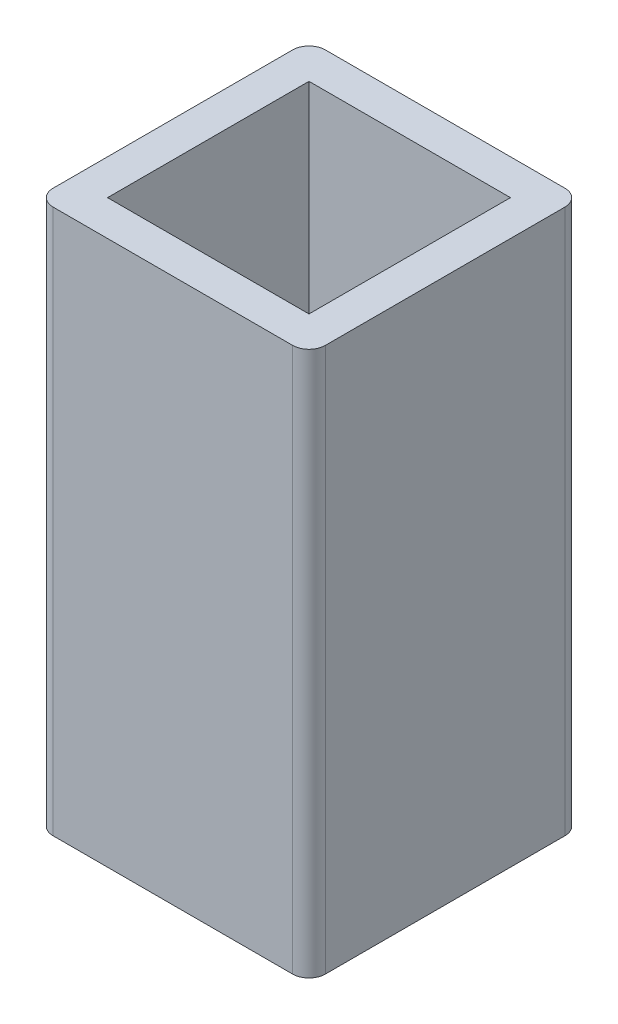
ISO-10303-21;
HEADER;
FILE_DESCRIPTION(('STEP AP214'),'2;1');
FILE_NAME('part.step','',(''),(''),'','','');
FILE_SCHEMA(('AUTOMOTIVE_DESIGN { 1 0 10303 214 1 1 1 1 }'));
ENDSEC;
DATA;
#1=APPLICATION_CONTEXT('core data for automotive mechanical design processes');
#2=APPLICATION_PROTOCOL_DEFINITION('international standard','automotive_design',2000,#1);
#3=PRODUCT_CONTEXT('',#1,'mechanical');
#4=PRODUCT('Part','Part','',(#3));
#5=PRODUCT_RELATED_PRODUCT_CATEGORY('part','',(#4));
#6=PRODUCT_DEFINITION_FORMATION('','',#4);
#7=PRODUCT_DEFINITION_CONTEXT('part definition',#1,'design');
#8=PRODUCT_DEFINITION('design','',#6,#7);
#9=PRODUCT_DEFINITION_SHAPE('','',#8);
#10=(LENGTH_UNIT() NAMED_UNIT(*) SI_UNIT(.MILLI.,.METRE.));
#11=(NAMED_UNIT(*) PLANE_ANGLE_UNIT() SI_UNIT($,.RADIAN.));
#12=(NAMED_UNIT(*) SI_UNIT($,.STERADIAN.) SOLID_ANGLE_UNIT());
#13=UNCERTAINTY_MEASURE_WITH_UNIT(LENGTH_MEASURE(1.E-05),#10,'distance_accuracy_value','');
#14=(GEOMETRIC_REPRESENTATION_CONTEXT(3) GLOBAL_UNCERTAINTY_ASSIGNED_CONTEXT((#13)) GLOBAL_UNIT_ASSIGNED_CONTEXT((#10,
#11,#12)) REPRESENTATION_CONTEXT('',''));
#15=CARTESIAN_POINT('',(0.,0.,0.));
#16=DIRECTION('',(0.,0.,1.));
#17=DIRECTION('',(1.,0.,0.));
#18=AXIS2_PLACEMENT_3D('',#15,#16,#17);
#19=CARTESIAN_POINT('',(-5.588,25.4,5.588));
#20=DIRECTION('',(0.,-1.,0.));
#21=DIRECTION('',(0.,0.,-1.));
#22=AXIS2_PLACEMENT_3D('',#19,#20,#21);
#23=PLANE('',#22);
#24=CARTESIAN_POINT('',(-5.588,25.4,5.588));
#25=DIRECTION('',(0.,1.,0.));
#26=DIRECTION('',(0.,0.,-1.));
#27=AXIS2_PLACEMENT_3D('',#24,#25,#26);
#28=CIRCLE('',#27,0.761999999999999);
#29=CARTESIAN_POINT('',(-6.35,25.4,5.588));
#30=VERTEX_POINT('',#29);
#31=CARTESIAN_POINT('',(-5.588,25.4,6.35));
#32=VERTEX_POINT('',#31);
#33=EDGE_CURVE('E183',#30,#32,#28,.T.);
#34=ORIENTED_EDGE('',*,*,#33,.T.);
#35=DIRECTION('',(1.,0.,0.));
#36=VECTOR('',#35,1.);
#37=CARTESIAN_POINT('',(-5.588,25.4,6.35));
#38=LINE('',#37,#36);
#39=CARTESIAN_POINT('',(5.588,25.4,6.35));
#40=VERTEX_POINT('',#39);
#41=EDGE_CURVE('E187',#32,#40,#38,.T.);
#42=ORIENTED_EDGE('',*,*,#41,.T.);
#43=CARTESIAN_POINT('',(5.588,25.4,5.588));
#44=DIRECTION('',(0.,1.,0.));
#45=DIRECTION('',(0.,0.,1.));
#46=AXIS2_PLACEMENT_3D('',#43,#44,#45);
#47=CIRCLE('',#46,0.761999999999999);
#48=CARTESIAN_POINT('',(6.35,25.4,5.588));
#49=VERTEX_POINT('',#48);
#50=EDGE_CURVE('E191',#40,#49,#47,.T.);
#51=ORIENTED_EDGE('',*,*,#50,.T.);
#52=DIRECTION('',(0.,0.,-1.));
#53=VECTOR('',#52,1.);
#54=CARTESIAN_POINT('',(6.35,25.4,5.588));
#55=LINE('',#54,#53);
#56=CARTESIAN_POINT('',(6.35,25.4,-5.588));
#57=VERTEX_POINT('',#56);
#58=EDGE_CURVE('E194',#49,#57,#55,.T.);
#59=ORIENTED_EDGE('',*,*,#58,.T.);
#60=CARTESIAN_POINT('',(5.588,25.4,-5.588));
#61=DIRECTION('',(0.,1.,0.));
#62=DIRECTION('',(0.,0.,-1.));
#63=AXIS2_PLACEMENT_3D('',#60,#61,#62);
#64=CIRCLE('',#63,0.761999999999999);
#65=CARTESIAN_POINT('',(5.588,25.4,-6.35));
#66=VERTEX_POINT('',#65);
#67=EDGE_CURVE('E197',#57,#66,#64,.T.);
#68=ORIENTED_EDGE('',*,*,#67,.T.);
#69=DIRECTION('',(-1.,0.,0.));
#70=VECTOR('',#69,1.);
#71=CARTESIAN_POINT('',(-5.588,25.4,-6.35));
#72=LINE('',#71,#70);
#73=CARTESIAN_POINT('',(-5.588,25.4,-6.35));
#74=VERTEX_POINT('',#73);
#75=EDGE_CURVE('E200',#66,#74,#72,.T.);
#76=ORIENTED_EDGE('',*,*,#75,.T.);
#77=CARTESIAN_POINT('',(-5.588,25.4,-5.588));
#78=DIRECTION('',(0.,1.,0.));
#79=DIRECTION('',(0.,0.,-1.));
#80=AXIS2_PLACEMENT_3D('',#77,#78,#79);
#81=CIRCLE('',#80,0.762000000000001);
#82=CARTESIAN_POINT('',(-6.35,25.4,-5.588));
#83=VERTEX_POINT('',#82);
#84=EDGE_CURVE('E203',#74,#83,#81,.T.);
#85=ORIENTED_EDGE('',*,*,#84,.T.);
#86=DIRECTION('',(0.,0.,1.));
#87=VECTOR('',#86,1.);
#88=CARTESIAN_POINT('',(-6.35,25.4,5.588));
#89=LINE('',#88,#87);
#90=EDGE_CURVE('E206',#83,#30,#89,.T.);
#91=ORIENTED_EDGE('',*,*,#90,.T.);
#92=EDGE_LOOP('',(#34,#42,#51,#59,#68,#76,#85,#91));
#93=FACE_BOUND('',#92,.T.);
#94=DIRECTION('',(1.,0.,0.));
#95=VECTOR('',#94,1.);
#96=CARTESIAN_POINT('',(-4.699,25.4,4.699));
#97=LINE('',#96,#95);
#98=CARTESIAN_POINT('',(-4.699,25.4,4.699));
#99=VERTEX_POINT('',#98);
#100=CARTESIAN_POINT('',(4.699,25.4,4.699));
#101=VERTEX_POINT('',#100);
#102=EDGE_CURVE('E135',#99,#101,#97,.T.);
#103=ORIENTED_EDGE('',*,*,#102,.F.);
#104=DIRECTION('',(0.,0.,1.));
#105=VECTOR('',#104,1.);
#106=CARTESIAN_POINT('',(-4.699,25.4,4.699));
#107=LINE('',#106,#105);
#108=CARTESIAN_POINT('',(-4.699,25.4,-4.699));
#109=VERTEX_POINT('',#108);
#110=EDGE_CURVE('E161',#109,#99,#107,.T.);
#111=ORIENTED_EDGE('',*,*,#110,.F.);
#112=DIRECTION('',(-1.,0.,0.));
#113=VECTOR('',#112,1.);
#114=CARTESIAN_POINT('',(-4.699,25.4,-4.699));
#115=LINE('',#114,#113);
#116=CARTESIAN_POINT('',(4.699,25.4,-4.699));
#117=VERTEX_POINT('',#116);
#118=EDGE_CURVE('E157',#117,#109,#115,.T.);
#119=ORIENTED_EDGE('',*,*,#118,.F.);
#120=DIRECTION('',(0.,0.,-1.));
#121=VECTOR('',#120,1.);
#122=CARTESIAN_POINT('',(4.699,25.4,4.699));
#123=LINE('',#122,#121);
#124=EDGE_CURVE('E144',#101,#117,#123,.T.);
#125=ORIENTED_EDGE('',*,*,#124,.F.);
#126=EDGE_LOOP('',(#103,#111,#119,#125));
#127=FACE_BOUND('',#126,.T.);
#128=ADVANCED_FACE('F45',(#93,#127),#23,.F.);
#129=CARTESIAN_POINT('',(-5.588,0.,5.588));
#130=DIRECTION('',(0.,-1.,0.));
#131=DIRECTION('',(0.,0.,-1.));
#132=AXIS2_PLACEMENT_3D('',#129,#130,#131);
#133=PLANE('',#132);
#134=CARTESIAN_POINT('',(-5.588,0.,5.588));
#135=DIRECTION('',(0.,1.,0.));
#136=DIRECTION('',(0.,0.,-1.));
#137=AXIS2_PLACEMENT_3D('',#134,#135,#136);
#138=CIRCLE('',#137,0.761999999999999);
#139=CARTESIAN_POINT('',(-6.35,0.,5.588));
#140=VERTEX_POINT('',#139);
#141=CARTESIAN_POINT('',(-5.588,0.,6.35));
#142=VERTEX_POINT('',#141);
#143=EDGE_CURVE('E153',#140,#142,#138,.T.);
#144=ORIENTED_EDGE('',*,*,#143,.F.);
#145=DIRECTION('',(0.,0.,1.));
#146=VECTOR('',#145,1.);
#147=CARTESIAN_POINT('',(-6.35,0.,5.588));
#148=LINE('',#147,#146);
#149=CARTESIAN_POINT('',(-6.35,0.,-5.588));
#150=VERTEX_POINT('',#149);
#151=EDGE_CURVE('E188',#150,#140,#148,.T.);
#152=ORIENTED_EDGE('',*,*,#151,.F.);
#153=CARTESIAN_POINT('',(-5.588,0.,-5.588));
#154=DIRECTION('',(0.,1.,0.));
#155=DIRECTION('',(0.,0.,-1.));
#156=AXIS2_PLACEMENT_3D('',#153,#154,#155);
#157=CIRCLE('',#156,0.762000000000001);
#158=CARTESIAN_POINT('',(-5.588,0.,-6.35));
#159=VERTEX_POINT('',#158);
#160=EDGE_CURVE('E228',#159,#150,#157,.T.);
#161=ORIENTED_EDGE('',*,*,#160,.F.);
#162=DIRECTION('',(-1.,0.,0.));
#163=VECTOR('',#162,1.);
#164=CARTESIAN_POINT('',(-5.588,0.,-6.35));
#165=LINE('',#164,#163);
#166=CARTESIAN_POINT('',(5.588,0.,-6.35));
#167=VERTEX_POINT('',#166);
#168=EDGE_CURVE('E225',#167,#159,#165,.T.);
#169=ORIENTED_EDGE('',*,*,#168,.F.);
#170=CARTESIAN_POINT('',(5.588,0.,-5.588));
#171=DIRECTION('',(0.,1.,0.));
#172=DIRECTION('',(0.,0.,-1.));
#173=AXIS2_PLACEMENT_3D('',#170,#171,#172);
#174=CIRCLE('',#173,0.761999999999999);
#175=CARTESIAN_POINT('',(6.35,0.,-5.588));
#176=VERTEX_POINT('',#175);
#177=EDGE_CURVE('E222',#176,#167,#174,.T.);
#178=ORIENTED_EDGE('',*,*,#177,.F.);
#179=DIRECTION('',(0.,0.,-1.));
#180=VECTOR('',#179,1.);
#181=CARTESIAN_POINT('',(6.35,0.,5.588));
#182=LINE('',#181,#180);
#183=CARTESIAN_POINT('',(6.35,0.,5.588));
#184=VERTEX_POINT('',#183);
#185=EDGE_CURVE('E219',#184,#176,#182,.T.);
#186=ORIENTED_EDGE('',*,*,#185,.F.);
#187=CARTESIAN_POINT('',(5.588,0.,5.588));
#188=DIRECTION('',(0.,1.,0.));
#189=DIRECTION('',(0.,0.,1.));
#190=AXIS2_PLACEMENT_3D('',#187,#188,#189);
#191=CIRCLE('',#190,0.761999999999999);
#192=CARTESIAN_POINT('',(5.588,0.,6.35));
#193=VERTEX_POINT('',#192);
#194=EDGE_CURVE('E216',#193,#184,#191,.T.);
#195=ORIENTED_EDGE('',*,*,#194,.F.);
#196=DIRECTION('',(1.,0.,0.));
#197=VECTOR('',#196,1.);
#198=CARTESIAN_POINT('',(-5.588,0.,6.35));
#199=LINE('',#198,#197);
#200=EDGE_CURVE('E213',#142,#193,#199,.T.);
#201=ORIENTED_EDGE('',*,*,#200,.F.);
#202=EDGE_LOOP('',(#144,#152,#161,#169,#178,#186,#195,#201));
#203=FACE_BOUND('',#202,.T.);
#204=DIRECTION('',(0.,0.,1.));
#205=VECTOR('',#204,1.);
#206=CARTESIAN_POINT('',(-4.699,0.,4.699));
#207=LINE('',#206,#205);
#208=CARTESIAN_POINT('',(-4.699,0.,-4.699));
#209=VERTEX_POINT('',#208);
#210=CARTESIAN_POINT('',(-4.699,0.,4.699));
#211=VERTEX_POINT('',#210);
#212=EDGE_CURVE('E145',#209,#211,#207,.T.);
#213=ORIENTED_EDGE('',*,*,#212,.T.);
#214=DIRECTION('',(1.,0.,0.));
#215=VECTOR('',#214,1.);
#216=CARTESIAN_POINT('',(-4.699,0.,4.699));
#217=LINE('',#216,#215);
#218=CARTESIAN_POINT('',(4.699,0.,4.699));
#219=VERTEX_POINT('',#218);
#220=EDGE_CURVE('E69',#211,#219,#217,.T.);
#221=ORIENTED_EDGE('',*,*,#220,.T.);
#222=DIRECTION('',(0.,0.,-1.));
#223=VECTOR('',#222,1.);
#224=CARTESIAN_POINT('',(4.699,0.,4.699));
#225=LINE('',#224,#223);
#226=CARTESIAN_POINT('',(4.699,0.,-4.699));
#227=VERTEX_POINT('',#226);
#228=EDGE_CURVE('E151',#219,#227,#225,.T.);
#229=ORIENTED_EDGE('',*,*,#228,.T.);
#230=DIRECTION('',(-1.,0.,0.));
#231=VECTOR('',#230,1.);
#232=CARTESIAN_POINT('',(-4.699,0.,-4.699));
#233=LINE('',#232,#231);
#234=EDGE_CURVE('E170',#227,#209,#233,.T.);
#235=ORIENTED_EDGE('',*,*,#234,.T.);
#236=EDGE_LOOP('',(#213,#221,#229,#235));
#237=FACE_BOUND('',#236,.T.);
#238=ADVANCED_FACE('F267',(#203,#237),#133,.T.);
#239=CARTESIAN_POINT('',(-5.588,25.4,5.588));
#240=DIRECTION('',(0.,-1.,0.));
#241=DIRECTION('',(0.,0.,-1.));
#242=AXIS2_PLACEMENT_3D('',#239,#240,#241);
#243=CYLINDRICAL_SURFACE('',#242,0.761999999999999);
#244=ORIENTED_EDGE('',*,*,#143,.T.);
#245=DIRECTION('',(0.,-1.,0.));
#246=VECTOR('',#245,1.);
#247=CARTESIAN_POINT('',(-5.588,25.4,6.35));
#248=LINE('',#247,#246);
#249=EDGE_CURVE('E11',#32,#142,#248,.T.);
#250=ORIENTED_EDGE('',*,*,#249,.F.);
#251=ORIENTED_EDGE('',*,*,#33,.F.);
#252=DIRECTION('',(0.,-1.,0.));
#253=VECTOR('',#252,1.);
#254=CARTESIAN_POINT('',(-6.35,25.4,5.588));
#255=LINE('',#254,#253);
#256=EDGE_CURVE('E209',#30,#140,#255,.T.);
#257=ORIENTED_EDGE('',*,*,#256,.T.);
#258=EDGE_LOOP('',(#244,#250,#251,#257));
#259=FACE_BOUND('',#258,.T.);
#260=ADVANCED_FACE('F47',(#259),#243,.T.);
#261=CARTESIAN_POINT('',(-5.588,25.4,6.35));
#262=DIRECTION('',(0.,0.,-1.));
#263=DIRECTION('',(-1.,0.,0.));
#264=AXIS2_PLACEMENT_3D('',#261,#262,#263);
#265=PLANE('',#264);
#266=ORIENTED_EDGE('',*,*,#200,.T.);
#267=DIRECTION('',(0.,-1.,0.));
#268=VECTOR('',#267,1.);
#269=CARTESIAN_POINT('',(5.588,25.4,6.35));
#270=LINE('',#269,#268);
#271=EDGE_CURVE('E54',#40,#193,#270,.T.);
#272=ORIENTED_EDGE('',*,*,#271,.F.);
#273=ORIENTED_EDGE('',*,*,#41,.F.);
#274=ORIENTED_EDGE('',*,*,#249,.T.);
#275=EDGE_LOOP('',(#266,#272,#273,#274));
#276=FACE_BOUND('',#275,.T.);
#277=ADVANCED_FACE('F284',(#276),#265,.F.);
#278=CARTESIAN_POINT('',(5.588,25.4,5.588));
#279=DIRECTION('',(0.,-1.,0.));
#280=DIRECTION('',(0.,0.,-1.));
#281=AXIS2_PLACEMENT_3D('',#278,#279,#280);
#282=CYLINDRICAL_SURFACE('',#281,0.761999999999999);
#283=ORIENTED_EDGE('',*,*,#194,.T.);
#284=DIRECTION('',(0.,-1.,0.));
#285=VECTOR('',#284,1.);
#286=CARTESIAN_POINT('',(6.35,25.4,5.588));
#287=LINE('',#286,#285);
#288=EDGE_CURVE('E252',#49,#184,#287,.T.);
#289=ORIENTED_EDGE('',*,*,#288,.F.);
#290=ORIENTED_EDGE('',*,*,#50,.F.);
#291=ORIENTED_EDGE('',*,*,#271,.T.);
#292=EDGE_LOOP('',(#283,#289,#290,#291));
#293=FACE_BOUND('',#292,.T.);
#294=ADVANCED_FACE('F261',(#293),#282,.T.);
#295=CARTESIAN_POINT('',(6.35,25.4,5.588));
#296=DIRECTION('',(-1.,0.,0.));
#297=DIRECTION('',(0.,0.,1.));
#298=AXIS2_PLACEMENT_3D('',#295,#296,#297);
#299=PLANE('',#298);
#300=ORIENTED_EDGE('',*,*,#185,.T.);
#301=DIRECTION('',(0.,-1.,0.));
#302=VECTOR('',#301,1.);
#303=CARTESIAN_POINT('',(6.35,25.4,-5.588));
#304=LINE('',#303,#302);
#305=EDGE_CURVE('E248',#57,#176,#304,.T.);
#306=ORIENTED_EDGE('',*,*,#305,.F.);
#307=ORIENTED_EDGE('',*,*,#58,.F.);
#308=ORIENTED_EDGE('',*,*,#288,.T.);
#309=EDGE_LOOP('',(#300,#306,#307,#308));
#310=FACE_BOUND('',#309,.T.);
#311=ADVANCED_FACE('F273',(#310),#299,.F.);
#312=CARTESIAN_POINT('',(5.588,25.4,-5.588));
#313=DIRECTION('',(0.,-1.,0.));
#314=DIRECTION('',(0.,0.,-1.));
#315=AXIS2_PLACEMENT_3D('',#312,#313,#314);
#316=CYLINDRICAL_SURFACE('',#315,0.761999999999999);
#317=ORIENTED_EDGE('',*,*,#177,.T.);
#318=DIRECTION('',(0.,-1.,0.));
#319=VECTOR('',#318,1.);
#320=CARTESIAN_POINT('',(5.588,25.4,-6.35));
#321=LINE('',#320,#319);
#322=EDGE_CURVE('E244',#66,#167,#321,.T.);
#323=ORIENTED_EDGE('',*,*,#322,.F.);
#324=ORIENTED_EDGE('',*,*,#67,.F.);
#325=ORIENTED_EDGE('',*,*,#305,.T.);
#326=EDGE_LOOP('',(#317,#323,#324,#325));
#327=FACE_BOUND('',#326,.T.);
#328=ADVANCED_FACE('F277',(#327),#316,.T.);
#329=CARTESIAN_POINT('',(-5.588,25.4,-6.35));
#330=DIRECTION('',(0.,0.,1.));
#331=DIRECTION('',(1.,0.,0.));
#332=AXIS2_PLACEMENT_3D('',#329,#330,#331);
#333=PLANE('',#332);
#334=ORIENTED_EDGE('',*,*,#168,.T.);
#335=DIRECTION('',(0.,-1.,0.));
#336=VECTOR('',#335,1.);
#337=CARTESIAN_POINT('',(-5.588,25.4,-6.35));
#338=LINE('',#337,#336);
#339=EDGE_CURVE('E240',#74,#159,#338,.T.);
#340=ORIENTED_EDGE('',*,*,#339,.F.);
#341=ORIENTED_EDGE('',*,*,#75,.F.);
#342=ORIENTED_EDGE('',*,*,#322,.T.);
#343=EDGE_LOOP('',(#334,#340,#341,#342));
#344=FACE_BOUND('',#343,.T.);
#345=ADVANCED_FACE('F297',(#344),#333,.F.);
#346=CARTESIAN_POINT('',(-5.588,25.4,-5.588));
#347=DIRECTION('',(0.,-1.,0.));
#348=DIRECTION('',(0.,0.,-1.));
#349=AXIS2_PLACEMENT_3D('',#346,#347,#348);
#350=CYLINDRICAL_SURFACE('',#349,0.762000000000001);
#351=ORIENTED_EDGE('',*,*,#160,.T.);
#352=DIRECTION('',(0.,-1.,0.));
#353=VECTOR('',#352,1.);
#354=CARTESIAN_POINT('',(-6.35,25.4,-5.588));
#355=LINE('',#354,#353);
#356=EDGE_CURVE('E236',#83,#150,#355,.T.);
#357=ORIENTED_EDGE('',*,*,#356,.F.);
#358=ORIENTED_EDGE('',*,*,#84,.F.);
#359=ORIENTED_EDGE('',*,*,#339,.T.);
#360=EDGE_LOOP('',(#351,#357,#358,#359));
#361=FACE_BOUND('',#360,.T.);
#362=ADVANCED_FACE('F295',(#361),#350,.T.);
#363=CARTESIAN_POINT('',(-6.35,25.4,5.588));
#364=DIRECTION('',(1.,0.,0.));
#365=DIRECTION('',(0.,0.,-1.));
#366=AXIS2_PLACEMENT_3D('',#363,#364,#365);
#367=PLANE('',#366);
#368=ORIENTED_EDGE('',*,*,#151,.T.);
#369=ORIENTED_EDGE('',*,*,#256,.F.);
#370=ORIENTED_EDGE('',*,*,#90,.F.);
#371=ORIENTED_EDGE('',*,*,#356,.T.);
#372=EDGE_LOOP('',(#368,#369,#370,#371));
#373=FACE_BOUND('',#372,.T.);
#374=ADVANCED_FACE('F290',(#373),#367,.F.);
#375=CARTESIAN_POINT('',(-4.699,25.4,4.699));
#376=DIRECTION('',(0.,0.,-1.));
#377=DIRECTION('',(-1.,0.,0.));
#378=AXIS2_PLACEMENT_3D('',#375,#376,#377);
#379=PLANE('',#378);
#380=ORIENTED_EDGE('',*,*,#220,.F.);
#381=DIRECTION('',(0.,-1.,0.));
#382=VECTOR('',#381,1.);
#383=CARTESIAN_POINT('',(-4.699,25.4,4.699));
#384=LINE('',#383,#382);
#385=EDGE_CURVE('E139',#99,#211,#384,.T.);
#386=ORIENTED_EDGE('',*,*,#385,.F.);
#387=ORIENTED_EDGE('',*,*,#102,.T.);
#388=DIRECTION('',(0.,-1.,0.));
#389=VECTOR('',#388,1.);
#390=CARTESIAN_POINT('',(4.699,25.4,4.699));
#391=LINE('',#390,#389);
#392=EDGE_CURVE('E138',#101,#219,#391,.T.);
#393=ORIENTED_EDGE('',*,*,#392,.T.);
#394=EDGE_LOOP('',(#380,#386,#387,#393));
#395=FACE_BOUND('',#394,.T.);
#396=ADVANCED_FACE('F137',(#395),#379,.T.);
#397=CARTESIAN_POINT('',(4.699,25.4,4.699));
#398=DIRECTION('',(-1.,0.,0.));
#399=DIRECTION('',(0.,0.,1.));
#400=AXIS2_PLACEMENT_3D('',#397,#398,#399);
#401=PLANE('',#400);
#402=ORIENTED_EDGE('',*,*,#228,.F.);
#403=ORIENTED_EDGE('',*,*,#392,.F.);
#404=ORIENTED_EDGE('',*,*,#124,.T.);
#405=DIRECTION('',(0.,-1.,0.));
#406=VECTOR('',#405,1.);
#407=CARTESIAN_POINT('',(4.699,25.4,-4.699));
#408=LINE('',#407,#406);
#409=EDGE_CURVE('E154',#117,#227,#408,.T.);
#410=ORIENTED_EDGE('',*,*,#409,.T.);
#411=EDGE_LOOP('',(#402,#403,#404,#410));
#412=FACE_BOUND('',#411,.T.);
#413=ADVANCED_FACE('F148',(#412),#401,.T.);
#414=CARTESIAN_POINT('',(-4.699,25.4,-4.699));
#415=DIRECTION('',(0.,0.,1.));
#416=DIRECTION('',(1.,0.,0.));
#417=AXIS2_PLACEMENT_3D('',#414,#415,#416);
#418=PLANE('',#417);
#419=ORIENTED_EDGE('',*,*,#234,.F.);
#420=ORIENTED_EDGE('',*,*,#409,.F.);
#421=ORIENTED_EDGE('',*,*,#118,.T.);
#422=DIRECTION('',(0.,-1.,0.));
#423=VECTOR('',#422,1.);
#424=CARTESIAN_POINT('',(-4.699,25.4,-4.699));
#425=LINE('',#424,#423);
#426=EDGE_CURVE('E61',#109,#209,#425,.T.);
#427=ORIENTED_EDGE('',*,*,#426,.T.);
#428=EDGE_LOOP('',(#419,#420,#421,#427));
#429=FACE_BOUND('',#428,.T.);
#430=ADVANCED_FACE('F322',(#429),#418,.T.);
#431=CARTESIAN_POINT('',(-4.699,25.4,4.699));
#432=DIRECTION('',(1.,0.,0.));
#433=DIRECTION('',(0.,0.,-1.));
#434=AXIS2_PLACEMENT_3D('',#431,#432,#433);
#435=PLANE('',#434);
#436=ORIENTED_EDGE('',*,*,#212,.F.);
#437=ORIENTED_EDGE('',*,*,#426,.F.);
#438=ORIENTED_EDGE('',*,*,#110,.T.);
#439=ORIENTED_EDGE('',*,*,#385,.T.);
#440=EDGE_LOOP('',(#436,#437,#438,#439));
#441=FACE_BOUND('',#440,.T.);
#442=ADVANCED_FACE('F326',(#441),#435,.T.);
#443=CLOSED_SHELL('',(#128,#238,#260,#277,#294,#311,#328,#345,#362,#374,#396,#413,#430,#442));
#444=MANIFOLD_SOLID_BREP('B2',#443);
#445=ADVANCED_BREP_SHAPE_REPRESENTATION('',(#18,#444),#14);
#446=SHAPE_DEFINITION_REPRESENTATION(#9,#445);
ENDSEC;
END-ISO-10303-21;
